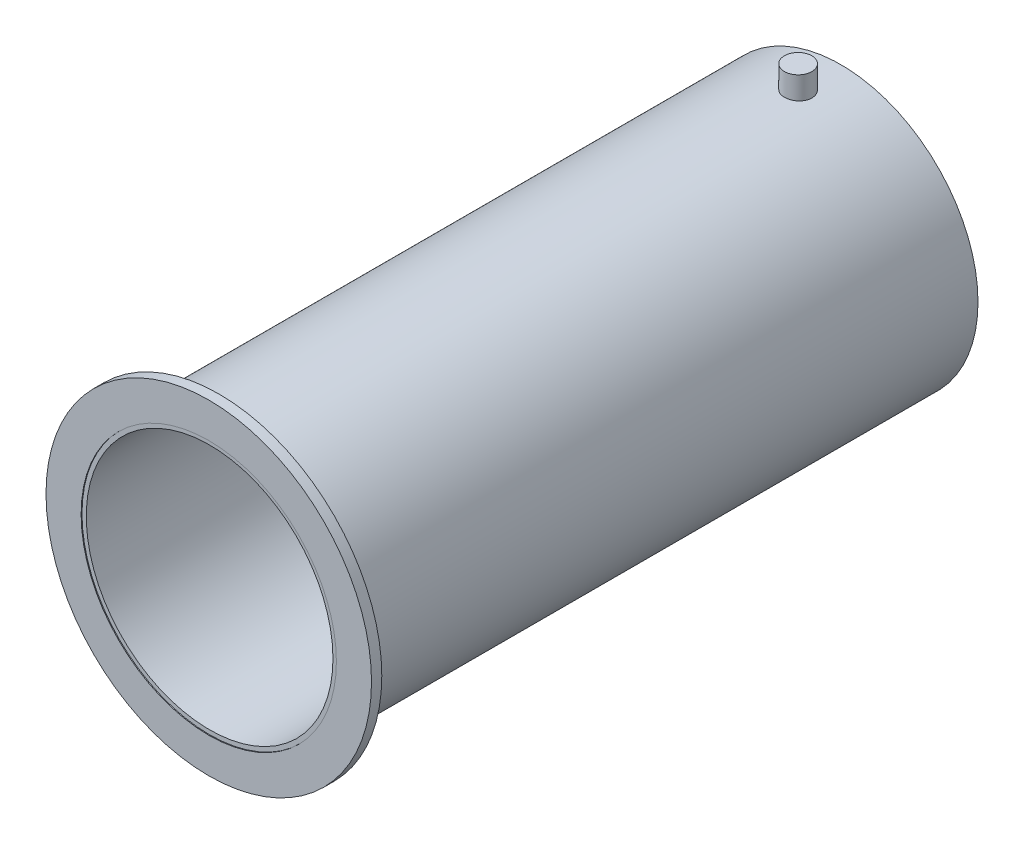
ISO-10303-21;
HEADER;
FILE_DESCRIPTION(('STEP AP214'),'2;1');
FILE_NAME('part.step','',(''),(''),'','','');
FILE_SCHEMA(('AUTOMOTIVE_DESIGN { 1 0 10303 214 1 1 1 1 }'));
ENDSEC;
DATA;
#1=APPLICATION_CONTEXT('core data for automotive mechanical design processes');
#2=APPLICATION_PROTOCOL_DEFINITION('international standard','automotive_design',2000,#1);
#3=PRODUCT_CONTEXT('',#1,'mechanical');
#4=PRODUCT('Part','Part','',(#3));
#5=PRODUCT_RELATED_PRODUCT_CATEGORY('part','',(#4));
#6=PRODUCT_DEFINITION_FORMATION('','',#4);
#7=PRODUCT_DEFINITION_CONTEXT('part definition',#1,'design');
#8=PRODUCT_DEFINITION('design','',#6,#7);
#9=PRODUCT_DEFINITION_SHAPE('','',#8);
#10=(LENGTH_UNIT() NAMED_UNIT(*) SI_UNIT(.MILLI.,.METRE.));
#11=(NAMED_UNIT(*) PLANE_ANGLE_UNIT() SI_UNIT($,.RADIAN.));
#12=(NAMED_UNIT(*) SI_UNIT($,.STERADIAN.) SOLID_ANGLE_UNIT());
#13=UNCERTAINTY_MEASURE_WITH_UNIT(LENGTH_MEASURE(1.E-05),#10,'distance_accuracy_value','');
#14=(GEOMETRIC_REPRESENTATION_CONTEXT(3) GLOBAL_UNCERTAINTY_ASSIGNED_CONTEXT((#13)) GLOBAL_UNIT_ASSIGNED_CONTEXT((#10,
#11,#12)) REPRESENTATION_CONTEXT('',''));
#15=CARTESIAN_POINT('',(0.,0.,0.));
#16=DIRECTION('',(0.,0.,1.));
#17=DIRECTION('',(1.,0.,0.));
#18=AXIS2_PLACEMENT_3D('',#15,#16,#17);
#19=CARTESIAN_POINT('',(48.,0.,-4.));
#20=DIRECTION('',(0.,0.,-1.));
#21=DIRECTION('',(-1.,0.,0.));
#22=AXIS2_PLACEMENT_3D('',#19,#20,#21);
#23=CYLINDRICAL_SURFACE('',#22,16.);
#24=CARTESIAN_POINT('',(48.,0.,-12.));
#25=DIRECTION('',(0.,0.,1.));
#26=DIRECTION('',(1.,0.,0.));
#27=AXIS2_PLACEMENT_3D('',#24,#25,#26);
#28=CIRCLE('',#27,16.);
#29=CARTESIAN_POINT('',(64.,0.,-12.));
#30=VERTEX_POINT('',#29);
#31=EDGE_CURVE('E118',#30,#30,#28,.T.);
#32=ORIENTED_EDGE('',*,*,#31,.T.);
#33=EDGE_LOOP('',(#32));
#34=FACE_BOUND('',#33,.T.);
#35=CARTESIAN_POINT('',(48.,0.,60.6));
#36=DIRECTION('',(0.,0.,1.));
#37=DIRECTION('',(1.,0.,0.));
#38=AXIS2_PLACEMENT_3D('',#35,#36,#37);
#39=CIRCLE('',#38,16.);
#40=CARTESIAN_POINT('',(64.,0.,60.6));
#41=VERTEX_POINT('',#40);
#42=EDGE_CURVE('E57',#41,#41,#39,.T.);
#43=ORIENTED_EDGE('',*,*,#42,.F.);
#44=EDGE_LOOP('',(#43));
#45=FACE_BOUND('',#44,.T.);
#46=CARTESIAN_POINT('',(48.,16.,-8.6));
#47=CARTESIAN_POINT('',(47.9103674339335,15.9999989683323,-8.59999611855939));
#48=CARTESIAN_POINT('',(47.8206756077316,15.9992388095393,-8.59244276976569));
#49=CARTESIAN_POINT('',(47.6437785624051,15.9962794815158,-8.56242500753531));
#50=CARTESIAN_POINT('',(47.5565761933299,15.9940787269444,-8.53994416636066));
#51=CARTESIAN_POINT('',(47.3872453192745,15.9884866330091,-8.48073241504346));
#52=CARTESIAN_POINT('',(47.3051137846162,15.9850960128113,-8.44401011117044));
#53=CARTESIAN_POINT('',(47.1481981424634,15.9775033183089,-8.35737454730937));
#54=CARTESIAN_POINT('',(47.0734125779535,15.9733014054101,-8.30746391039978));
#55=CARTESIAN_POINT('',(46.9330247189215,15.9645399094612,-8.19567568374036));
#56=CARTESIAN_POINT('',(46.8674525682642,15.9599792251818,-8.13376032095674));
#57=CARTESIAN_POINT('',(46.7476119657104,15.9510233105002,-7.99980074517915));
#58=CARTESIAN_POINT('',(46.6933440366678,15.9466280877587,-7.92775606393218));
#59=CARTESIAN_POINT('',(46.5975456472902,15.9384894648445,-7.7753943493062));
#60=CARTESIAN_POINT('',(46.5560424552722,15.9347474673745,-7.69506008944822));
#61=CARTESIAN_POINT('',(46.4871257844116,15.9283526007444,-7.52851906255203));
#62=CARTESIAN_POINT('',(46.4597119574539,15.9256997046756,-7.44231244066568));
#63=CARTESIAN_POINT('',(46.419841533437,15.9217933451676,-7.26678111861438));
#64=CARTESIAN_POINT('',(46.4073349551939,15.9205352063695,-7.17746787703647));
#65=CARTESIAN_POINT('',(46.3974795437834,15.9195462889684,-6.99800181856675));
#66=CARTESIAN_POINT('',(46.4001303122067,15.9198154702199,-6.9078490238047));
#67=CARTESIAN_POINT('',(46.4204731515957,15.921846510383,-6.72960750449069));
#68=CARTESIAN_POINT('',(46.4381106494007,15.9236029534504,-6.64151248107409));
#69=CARTESIAN_POINT('',(46.4878413693591,15.9284021485987,-6.46953925887825));
#70=CARTESIAN_POINT('',(46.5199347867908,15.9314449180559,-6.38566111707995));
#71=CARTESIAN_POINT('',(46.5977265697896,15.9384801512331,-6.22433026032178));
#72=CARTESIAN_POINT('',(46.643449147648,15.9424743025305,-6.14688929681709));
#73=CARTESIAN_POINT('',(46.7471839562348,15.9509608277261,-6.00075965614099));
#74=CARTESIAN_POINT('',(46.8051965466616,15.9554532162046,-5.93207123522918));
#75=CARTESIAN_POINT('',(46.9321694201407,15.9644541650078,-5.80507936961756));
#76=CARTESIAN_POINT('',(47.0011768338378,15.968962709328,-5.74682303699072));
#77=CARTESIAN_POINT('',(47.1480168292206,15.9774692652563,-5.64271418734338));
#78=CARTESIAN_POINT('',(47.2258494208006,15.9814672762921,-5.59686168422964));
#79=CARTESIAN_POINT('',(47.3881630308922,15.9885036106735,-5.5188639675036));
#80=CARTESIAN_POINT('',(47.4726452057762,15.9915417666363,-5.4867211442911));
#81=CARTESIAN_POINT('',(47.6458444522721,15.9963143590625,-5.4370897332612));
#82=CARTESIAN_POINT('',(47.7345613971574,15.998048834513,-5.41960070721501));
#83=CARTESIAN_POINT('',(47.913303841453,16.000013626693,-5.39983310762438));
#84=CARTESIAN_POINT('',(48.0033220833688,16.0002503722838,-5.397489522796));
#85=CARTESIAN_POINT('',(48.1824700693051,15.9992102681088,-5.40790858087802));
#86=CARTESIAN_POINT('',(48.2715998253127,15.9979334387915,-5.42067101970445));
#87=CARTESIAN_POINT('',(48.4462531309355,15.9940137846271,-5.46088591267452));
#88=CARTESIAN_POINT('',(48.5317837583552,15.9913737906886,-5.48830792716482));
#89=CARTESIAN_POINT('',(48.697030914214,15.9850239817697,-5.55703227845964));
#90=CARTESIAN_POINT('',(48.7767473122514,15.9813141428041,-5.59833492646304));
#91=CARTESIAN_POINT('',(48.9283970882754,15.9732236052868,-5.69380934186227));
#92=CARTESIAN_POINT('',(49.0003034555983,15.9688406976551,-5.74802382228131));
#93=CARTESIAN_POINT('',(49.134018597299,15.9599029259123,-5.86772170838548));
#94=CARTESIAN_POINT('',(49.1958271181587,15.9553480574875,-5.93320539691251));
#95=CARTESIAN_POINT('',(49.3078177758194,15.9465603862521,-6.0738665194544));
#96=CARTESIAN_POINT('',(49.3579572458873,15.9423288022236,-6.1490780104682));
#97=CARTESIAN_POINT('',(49.4448932139901,15.9346853193742,-6.3068917762347));
#98=CARTESIAN_POINT('',(49.4816898944862,15.9312734093446,-6.38949394990144));
#99=CARTESIAN_POINT('',(49.5408243338952,15.9256631621448,-6.55959798314528));
#100=CARTESIAN_POINT('',(49.563187479699,15.9234626951966,-6.6470909441458));
#101=CARTESIAN_POINT('',(49.5929024114071,15.920517844526,-6.82461311673724));
#102=CARTESIAN_POINT('',(49.6002546278392,15.919773419043,-6.91464225551308));
#103=CARTESIAN_POINT('',(49.599733021554,15.919825809721,-7.09425710137073));
#104=CARTESIAN_POINT('',(49.591926223349,15.9206158413921,-7.18384301261251));
#105=CARTESIAN_POINT('',(49.5614487247418,15.9236336622327,-7.36042386746926));
#106=CARTESIAN_POINT('',(49.5387780076194,15.9258614530195,-7.44741880816957));
#107=CARTESIAN_POINT('',(49.479234698076,15.931501892211,-7.61634775847657));
#108=CARTESIAN_POINT('',(49.4423640709455,15.9349143766458,-7.69828246660756));
#109=CARTESIAN_POINT('',(49.3554744878577,15.9425400294297,-7.85481102667366));
#110=CARTESIAN_POINT('',(49.3054556055287,15.9467531932952,-7.92940491971301));
#111=CARTESIAN_POINT('',(49.1934376900565,15.9555277953552,-8.0694778791551));
#112=CARTESIAN_POINT('',(49.1313887182244,15.960090635628,-8.13491692218734));
#113=CARTESIAN_POINT('',(48.9971707187602,15.9690376756605,-8.25448357231946));
#114=CARTESIAN_POINT('',(48.9249992705732,15.9734218323676,-8.30860846617147));
#115=CARTESIAN_POINT('',(48.7723862946581,15.9815289931066,-8.40411752616739));
#116=CARTESIAN_POINT('',(48.6919243989548,15.985250304429,-8.44546926551229));
#117=CARTESIAN_POINT('',(48.5252132465609,15.9915940679983,-8.51401987651819));
#118=CARTESIAN_POINT('',(48.438970639721,15.9942177585545,-8.54123470552567));
#119=CARTESIAN_POINT('',(48.2935332182491,15.9974114203797,-8.57395298733568));
#120=CARTESIAN_POINT('',(48.2352680845512,15.9983776110693,-8.58370727087897));
#121=CARTESIAN_POINT('',(48.1180105293077,15.9996722392126,-8.59673204169882));
#122=CARTESIAN_POINT('',(48.0590181107625,16.0000006792964,-8.60000255571498));
#123=CARTESIAN_POINT('',(48.,16.,-8.6));
#124=B_SPLINE_CURVE_WITH_KNOTS('',3,(#46,#47,#48,#49,#50,#51,#52,#53,#54,#55,#56,#57,#58,#59,
#60,#61,#62,#63,#64,#65,#66,#67,#68,#69,#70,#71,#72,#73,#74,#75,#76,#77,#78,#79,#80,#81,#82,#83,
#84,#85,#86,#87,#88,#89,#90,#91,#92,#93,#94,#95,#96,#97,#98,#99,#100,#101,#102,#103,#104,#105,
#106,#107,#108,#109,#110,#111,#112,#113,#114,#115,#116,#117,#118,#119,#120,#121,#122,#123),
.UNSPECIFIED.,.T.,.F.,(4,2,2,2,2,2,2,2,2,2,2,2,2,2,2,2,2,2,2,2,2,2,2,2,2,2,2,2,2,2,2,2,2,2,2,2,
2,2,4),(0.,0.268682186029559,0.537660548536776,0.80647661717152,1.07523926013245,
1.34486170979671,1.61449662753129,1.88470360755555,2.15490391108006,2.42419571272314,
2.69348043609242,2.96178875905777,3.23010070658613,3.49889218196631,3.767691525298,
4.0376757471393,4.30766027167634,4.5776918510973,4.84771535480702,5.11657901772411,
5.38543904830628,5.65374296470886,5.92205289679146,6.19126305197916,6.46047996496366,
6.73066629773757,7.00084893560598,7.27055504948804,7.54025342783335,7.80876206870329,
8.07727101161662,8.34574280580479,8.61421309662335,8.88382267884245,9.15349684219131,
9.42385009641986,9.6938975167247,9.87081067571756,10.0477231051044),.UNSPECIFIED.);
#125=CARTESIAN_POINT('',(48.,16.,-8.6));
#126=VERTEX_POINT('',#125);
#127=EDGE_CURVE('E55',#126,#126,#124,.T.);
#128=ORIENTED_EDGE('',*,*,#127,.F.);
#129=EDGE_LOOP('',(#128));
#130=FACE_BOUND('',#129,.T.);
#131=CARTESIAN_POINT('',(48.,-16.,-8.6));
#132=CARTESIAN_POINT('',(48.0896325660665,-15.9999989683323,-8.59999611855939));
#133=CARTESIAN_POINT('',(48.1793243922684,-15.9992388095393,-8.59244276976569));
#134=CARTESIAN_POINT('',(48.3562214375949,-15.9962794815158,-8.56242500753531));
#135=CARTESIAN_POINT('',(48.4434238066701,-15.9940787269444,-8.53994416636066));
#136=CARTESIAN_POINT('',(48.6127546807255,-15.9884866330091,-8.48073241504346));
#137=CARTESIAN_POINT('',(48.6948862153838,-15.9850960128113,-8.44401011117044));
#138=CARTESIAN_POINT('',(48.8518018575366,-15.9775033183089,-8.35737454730937));
#139=CARTESIAN_POINT('',(48.9265874220465,-15.9733014054101,-8.30746391039978));
#140=CARTESIAN_POINT('',(49.0669752810785,-15.9645399094612,-8.19567568374036));
#141=CARTESIAN_POINT('',(49.1325474317358,-15.9599792251818,-8.13376032095674));
#142=CARTESIAN_POINT('',(49.2523880342896,-15.9510233105002,-7.99980074517915));
#143=CARTESIAN_POINT('',(49.3066559633322,-15.9466280877587,-7.92775606393218));
#144=CARTESIAN_POINT('',(49.4024543527098,-15.9384894648445,-7.77539434930621));
#145=CARTESIAN_POINT('',(49.4439575447278,-15.9347474673745,-7.69506008944822));
#146=CARTESIAN_POINT('',(49.5128742155884,-15.9283526007444,-7.52851906255203));
#147=CARTESIAN_POINT('',(49.5402880425461,-15.9256997046756,-7.44231244066568));
#148=CARTESIAN_POINT('',(49.580158466563,-15.9217933451676,-7.26678111861438));
#149=CARTESIAN_POINT('',(49.5926650448061,-15.9205352063695,-7.17746787703647));
#150=CARTESIAN_POINT('',(49.6025204562166,-15.9195462889684,-6.99800181856675));
#151=CARTESIAN_POINT('',(49.5998696877933,-15.9198154702199,-6.9078490238047));
#152=CARTESIAN_POINT('',(49.5795268484043,-15.921846510383,-6.72960750449069));
#153=CARTESIAN_POINT('',(49.5618893505993,-15.9236029534504,-6.64151248107409));
#154=CARTESIAN_POINT('',(49.5121586306409,-15.9284021485987,-6.46953925887825));
#155=CARTESIAN_POINT('',(49.4800652132092,-15.9314449180559,-6.38566111707995));
#156=CARTESIAN_POINT('',(49.4022734302104,-15.9384801512331,-6.22433026032178));
#157=CARTESIAN_POINT('',(49.356550852352,-15.9424743025305,-6.1468892968171));
#158=CARTESIAN_POINT('',(49.2528160437652,-15.9509608277261,-6.00075965614099));
#159=CARTESIAN_POINT('',(49.1948034533384,-15.9554532162046,-5.93207123522918));
#160=CARTESIAN_POINT('',(49.0678305798593,-15.9644541650078,-5.80507936961756));
#161=CARTESIAN_POINT('',(48.9988231661622,-15.968962709328,-5.74682303699072));
#162=CARTESIAN_POINT('',(48.8519831707794,-15.9774692652563,-5.64271418734338));
#163=CARTESIAN_POINT('',(48.7741505791994,-15.9814672762921,-5.59686168422964));
#164=CARTESIAN_POINT('',(48.6118369691078,-15.9885036106735,-5.5188639675036));
#165=CARTESIAN_POINT('',(48.5273547942238,-15.9915417666363,-5.4867211442911));
#166=CARTESIAN_POINT('',(48.3541555477279,-15.9963143590625,-5.4370897332612));
#167=CARTESIAN_POINT('',(48.2654386028426,-15.998048834513,-5.41960070721501));
#168=CARTESIAN_POINT('',(48.086696158547,-16.000013626693,-5.39983310762438));
#169=CARTESIAN_POINT('',(47.9966779166312,-16.0002503722838,-5.397489522796));
#170=CARTESIAN_POINT('',(47.8175299306949,-15.9992102681088,-5.40790858087802));
#171=CARTESIAN_POINT('',(47.7284001746873,-15.9979334387915,-5.42067101970445));
#172=CARTESIAN_POINT('',(47.5537468690645,-15.9940137846271,-5.46088591267452));
#173=CARTESIAN_POINT('',(47.4682162416448,-15.9913737906886,-5.48830792716482));
#174=CARTESIAN_POINT('',(47.302969085786,-15.9850239817697,-5.55703227845964));
#175=CARTESIAN_POINT('',(47.2232526877486,-15.9813141428041,-5.59833492646304));
#176=CARTESIAN_POINT('',(47.0716029117246,-15.9732236052868,-5.69380934186227));
#177=CARTESIAN_POINT('',(46.9996965444017,-15.9688406976551,-5.74802382228131));
#178=CARTESIAN_POINT('',(46.865981402701,-15.9599029259123,-5.86772170838549));
#179=CARTESIAN_POINT('',(46.8041728818413,-15.9553480574875,-5.93320539691251));
#180=CARTESIAN_POINT('',(46.6921822241806,-15.9465603862521,-6.0738665194544));
#181=CARTESIAN_POINT('',(46.6420427541127,-15.9423288022236,-6.1490780104682));
#182=CARTESIAN_POINT('',(46.5551067860099,-15.9346853193742,-6.3068917762347));
#183=CARTESIAN_POINT('',(46.5183101055138,-15.9312734093446,-6.38949394990144));
#184=CARTESIAN_POINT('',(46.4591756661048,-15.9256631621448,-6.55959798314528));
#185=CARTESIAN_POINT('',(46.436812520301,-15.9234626951966,-6.6470909441458));
#186=CARTESIAN_POINT('',(46.4070975885929,-15.920517844526,-6.82461311673724));
#187=CARTESIAN_POINT('',(46.3997453721608,-15.919773419043,-6.91464225551308));
#188=CARTESIAN_POINT('',(46.400266978446,-15.919825809721,-7.09425710137073));
#189=CARTESIAN_POINT('',(46.408073776651,-15.9206158413921,-7.18384301261251));
#190=CARTESIAN_POINT('',(46.4385512752582,-15.9236336622327,-7.36042386746926));
#191=CARTESIAN_POINT('',(46.4612219923806,-15.9258614530195,-7.44741880816957));
#192=CARTESIAN_POINT('',(46.520765301924,-15.931501892211,-7.61634775847657));
#193=CARTESIAN_POINT('',(46.5576359290545,-15.9349143766458,-7.69828246660756));
#194=CARTESIAN_POINT('',(46.6445255121423,-15.9425400294297,-7.85481102667366));
#195=CARTESIAN_POINT('',(46.6945443944713,-15.9467531932952,-7.92940491971301));
#196=CARTESIAN_POINT('',(46.8065623099435,-15.9555277953552,-8.06947787915509));
#197=CARTESIAN_POINT('',(46.8686112817756,-15.960090635628,-8.13491692218733));
#198=CARTESIAN_POINT('',(47.0028292812398,-15.9690376756605,-8.25448357231945));
#199=CARTESIAN_POINT('',(47.0750007294268,-15.9734218323676,-8.30860846617147));
#200=CARTESIAN_POINT('',(47.2276137053419,-15.9815289931066,-8.40411752616739));
#201=CARTESIAN_POINT('',(47.3080756010452,-15.985250304429,-8.44546926551229));
#202=CARTESIAN_POINT('',(47.4747867534391,-15.9915940679983,-8.51401987651819));
#203=CARTESIAN_POINT('',(47.561029360279,-15.9942177585545,-8.54123470552567));
#204=CARTESIAN_POINT('',(47.7064667817509,-15.9974114203797,-8.57395298733568));
#205=CARTESIAN_POINT('',(47.7647319154488,-15.9983776110693,-8.58370727087897));
#206=CARTESIAN_POINT('',(47.8819894706923,-15.9996722392126,-8.59673204169882));
#207=CARTESIAN_POINT('',(47.9409818892375,-16.0000006792964,-8.60000255571498));
#208=CARTESIAN_POINT('',(48.,-16.,-8.6));
#209=B_SPLINE_CURVE_WITH_KNOTS('',3,(#131,#132,#133,#134,#135,#136,#137,#138,#139,#140,#141,
#142,#143,#144,#145,#146,#147,#148,#149,#150,#151,#152,#153,#154,#155,#156,#157,#158,#159,#160,
#161,#162,#163,#164,#165,#166,#167,#168,#169,#170,#171,#172,#173,#174,#175,#176,#177,#178,#179,
#180,#181,#182,#183,#184,#185,#186,#187,#188,#189,#190,#191,#192,#193,#194,#195,#196,#197,#198,
#199,#200,#201,#202,#203,#204,#205,#206,#207,#208),.UNSPECIFIED.,.T.,.F.,(4,2,2,2,2,2,2,2,2,2,2,
2,2,2,2,2,2,2,2,2,2,2,2,2,2,2,2,2,2,2,2,2,2,2,2,2,2,2,4),(0.,0.268682186029559,
0.537660548536776,0.80647661717152,1.07523926013245,1.34486170979671,1.61449662753129,
1.88470360755555,2.15490391108006,2.42419571272314,2.69348043609242,2.96178875905777,
3.23010070658613,3.49889218196631,3.767691525298,4.0376757471393,4.30766027167634,
4.57769185109729,4.84771535480702,5.11657901772411,5.38543904830628,5.65374296470886,
5.92205289679146,6.19126305197916,6.46047996496366,6.73066629773757,7.00084893560598,
7.27055504948804,7.54025342783335,7.80876206870329,8.07727101161662,8.34574280580479,
8.61421309662335,8.88382267884243,9.15349684219131,9.42385009641986,9.6938975167247,
9.87081067571756,10.0477231051044),.UNSPECIFIED.);
#210=CARTESIAN_POINT('',(48.,-16.,-8.6));
#211=VERTEX_POINT('',#210);
#212=EDGE_CURVE('E10',#211,#211,#209,.T.);
#213=ORIENTED_EDGE('',*,*,#212,.F.);
#214=EDGE_LOOP('',(#213));
#215=FACE_BOUND('',#214,.T.);
#216=ADVANCED_FACE('F41',(#34,#45,#130,#215),#23,.T.);
#217=CARTESIAN_POINT('',(48.,0.,61.7));
#218=DIRECTION('',(0.,0.,1.));
#219=DIRECTION('',(1.,0.,0.));
#220=AXIS2_PLACEMENT_3D('',#217,#218,#219);
#221=PLANE('',#220);
#222=CARTESIAN_POINT('',(48.,0.,61.7));
#223=DIRECTION('',(0.,0.,1.));
#224=DIRECTION('',(1.,0.,0.));
#225=AXIS2_PLACEMENT_3D('',#222,#223,#224);
#226=CIRCLE('',#225,14.4);
#227=CARTESIAN_POINT('',(62.4,0.,61.7));
#228=VERTEX_POINT('',#227);
#229=EDGE_CURVE('E136',#228,#228,#226,.T.);
#230=ORIENTED_EDGE('',*,*,#229,.F.);
#231=EDGE_LOOP('',(#230));
#232=FACE_BOUND('',#231,.T.);
#233=CARTESIAN_POINT('',(48.,0.,61.7));
#234=DIRECTION('',(0.,0.,1.));
#235=DIRECTION('',(1.,0.,0.));
#236=AXIS2_PLACEMENT_3D('',#233,#234,#235);
#237=CIRCLE('',#236,14.9);
#238=CARTESIAN_POINT('',(62.9,0.,61.7));
#239=VERTEX_POINT('',#238);
#240=EDGE_CURVE('E58',#239,#239,#237,.F.);
#241=ORIENTED_EDGE('',*,*,#240,.F.);
#242=EDGE_LOOP('',(#241));
#243=FACE_BOUND('',#242,.T.);
#244=ADVANCED_FACE('F92',(#232,#243),#221,.T.);
#245=CARTESIAN_POINT('',(48.,0.,-4.));
#246=DIRECTION('',(0.,0.,1.));
#247=DIRECTION('',(1.,0.,0.));
#248=AXIS2_PLACEMENT_3D('',#245,#246,#247);
#249=PLANE('',#248);
#250=CARTESIAN_POINT('',(48.,0.,-4.));
#251=DIRECTION('',(0.,0.,1.));
#252=DIRECTION('',(1.,0.,0.));
#253=AXIS2_PLACEMENT_3D('',#250,#251,#252);
#254=CIRCLE('',#253,13.);
#255=CARTESIAN_POINT('',(61.,0.,-4.));
#256=VERTEX_POINT('',#255);
#257=EDGE_CURVE('E144',#256,#256,#254,.T.);
#258=ORIENTED_EDGE('',*,*,#257,.F.);
#259=EDGE_LOOP('',(#258));
#260=FACE_BOUND('',#259,.T.);
#261=CARTESIAN_POINT('',(48.,0.,-4.));
#262=DIRECTION('',(0.,0.,1.));
#263=DIRECTION('',(1.,0.,0.));
#264=AXIS2_PLACEMENT_3D('',#261,#262,#263);
#265=CIRCLE('',#264,14.4);
#266=CARTESIAN_POINT('',(62.4,0.,-4.));
#267=VERTEX_POINT('',#266);
#268=EDGE_CURVE('E134',#267,#267,#265,.T.);
#269=ORIENTED_EDGE('',*,*,#268,.T.);
#270=EDGE_LOOP('',(#269));
#271=FACE_BOUND('',#270,.T.);
#272=ADVANCED_FACE('F98',(#260,#271),#249,.T.);
#273=CARTESIAN_POINT('',(48.,0.,-12.));
#274=DIRECTION('',(0.,0.,1.));
#275=DIRECTION('',(1.,0.,0.));
#276=AXIS2_PLACEMENT_3D('',#273,#274,#275);
#277=PLANE('',#276);
#278=ORIENTED_EDGE('',*,*,#31,.F.);
#279=EDGE_LOOP('',(#278));
#280=FACE_BOUND('',#279,.T.);
#281=CARTESIAN_POINT('',(48.,0.,-12.));
#282=DIRECTION('',(0.,0.,1.));
#283=DIRECTION('',(1.,0.,0.));
#284=AXIS2_PLACEMENT_3D('',#281,#282,#283);
#285=CIRCLE('',#284,13.);
#286=CARTESIAN_POINT('',(61.,0.,-12.));
#287=VERTEX_POINT('',#286);
#288=EDGE_CURVE('E142',#287,#287,#285,.T.);
#289=ORIENTED_EDGE('',*,*,#288,.T.);
#290=EDGE_LOOP('',(#289));
#291=FACE_BOUND('',#290,.T.);
#292=ADVANCED_FACE('F105',(#280,#291),#277,.F.);
#293=CARTESIAN_POINT('',(48.,0.,-4.));
#294=DIRECTION('',(0.,0.,-1.));
#295=DIRECTION('',(-1.,0.,0.));
#296=AXIS2_PLACEMENT_3D('',#293,#294,#295);
#297=CYLINDRICAL_SURFACE('',#296,13.);
#298=ORIENTED_EDGE('',*,*,#257,.T.);
#299=EDGE_LOOP('',(#298));
#300=FACE_BOUND('',#299,.T.);
#301=ORIENTED_EDGE('',*,*,#288,.F.);
#302=EDGE_LOOP('',(#301));
#303=FACE_BOUND('',#302,.T.);
#304=ADVANCED_FACE('F91',(#300,#303),#297,.F.);
#305=CARTESIAN_POINT('',(48.,0.,61.7));
#306=DIRECTION('',(0.,0.,-1.));
#307=DIRECTION('',(-1.,0.,0.));
#308=AXIS2_PLACEMENT_3D('',#305,#306,#307);
#309=CYLINDRICAL_SURFACE('',#308,14.4);
#310=ORIENTED_EDGE('',*,*,#229,.T.);
#311=EDGE_LOOP('',(#310));
#312=FACE_BOUND('',#311,.T.);
#313=ORIENTED_EDGE('',*,*,#268,.F.);
#314=EDGE_LOOP('',(#313));
#315=FACE_BOUND('',#314,.T.);
#316=ADVANCED_FACE('F85',(#312,#315),#309,.F.);
#317=CARTESIAN_POINT('',(48.,0.,61.8));
#318=DIRECTION('',(0.,0.,1.));
#319=DIRECTION('',(1.,0.,0.));
#320=AXIS2_PLACEMENT_3D('',#317,#318,#319);
#321=PLANE('',#320);
#322=CARTESIAN_POINT('',(48.,0.,61.8));
#323=DIRECTION('',(0.,0.,1.));
#324=DIRECTION('',(1.,0.,0.));
#325=AXIS2_PLACEMENT_3D('',#322,#323,#324);
#326=CIRCLE('',#325,19.);
#327=CARTESIAN_POINT('',(67.,0.,61.8));
#328=VERTEX_POINT('',#327);
#329=EDGE_CURVE('E129',#328,#328,#326,.T.);
#330=ORIENTED_EDGE('',*,*,#329,.T.);
#331=EDGE_LOOP('',(#330));
#332=FACE_BOUND('',#331,.T.);
#333=CARTESIAN_POINT('',(48.,0.,61.8));
#334=DIRECTION('',(0.,0.,1.));
#335=DIRECTION('',(1.,0.,0.));
#336=AXIS2_PLACEMENT_3D('',#333,#334,#335);
#337=CIRCLE('',#336,14.9);
#338=CARTESIAN_POINT('',(62.9,0.,61.8));
#339=VERTEX_POINT('',#338);
#340=EDGE_CURVE('E128',#339,#339,#337,.T.);
#341=ORIENTED_EDGE('',*,*,#340,.F.);
#342=EDGE_LOOP('',(#341));
#343=FACE_BOUND('',#342,.T.);
#344=ADVANCED_FACE('F76',(#332,#343),#321,.T.);
#345=CARTESIAN_POINT('',(48.,0.,60.6));
#346=DIRECTION('',(0.,0.,1.));
#347=DIRECTION('',(1.,0.,0.));
#348=AXIS2_PLACEMENT_3D('',#345,#346,#347);
#349=PLANE('',#348);
#350=ORIENTED_EDGE('',*,*,#42,.T.);
#351=EDGE_LOOP('',(#350));
#352=FACE_BOUND('',#351,.T.);
#353=CARTESIAN_POINT('',(48.,0.,60.6));
#354=DIRECTION('',(0.,0.,1.));
#355=DIRECTION('',(1.,0.,0.));
#356=AXIS2_PLACEMENT_3D('',#353,#354,#355);
#357=CIRCLE('',#356,19.);
#358=CARTESIAN_POINT('',(67.,0.,60.6));
#359=VERTEX_POINT('',#358);
#360=EDGE_CURVE('E130',#359,#359,#357,.T.);
#361=ORIENTED_EDGE('',*,*,#360,.F.);
#362=EDGE_LOOP('',(#361));
#363=FACE_BOUND('',#362,.T.);
#364=ADVANCED_FACE('F84',(#352,#363),#349,.F.);
#365=CARTESIAN_POINT('',(48.,0.,61.8));
#366=DIRECTION('',(0.,0.,-1.));
#367=DIRECTION('',(-1.,0.,0.));
#368=AXIS2_PLACEMENT_3D('',#365,#366,#367);
#369=CYLINDRICAL_SURFACE('',#368,19.);
#370=ORIENTED_EDGE('',*,*,#329,.F.);
#371=EDGE_LOOP('',(#370));
#372=FACE_BOUND('',#371,.T.);
#373=ORIENTED_EDGE('',*,*,#360,.T.);
#374=EDGE_LOOP('',(#373));
#375=FACE_BOUND('',#374,.T.);
#376=ADVANCED_FACE('F80',(#372,#375),#369,.T.);
#377=CARTESIAN_POINT('',(48.,0.,61.8));
#378=DIRECTION('',(0.,0.,-1.));
#379=DIRECTION('',(-1.,0.,0.));
#380=AXIS2_PLACEMENT_3D('',#377,#378,#379);
#381=CYLINDRICAL_SURFACE('',#380,14.9);
#382=ORIENTED_EDGE('',*,*,#240,.T.);
#383=EDGE_LOOP('',(#382));
#384=FACE_BOUND('',#383,.T.);
#385=ORIENTED_EDGE('',*,*,#340,.T.);
#386=EDGE_LOOP('',(#385));
#387=FACE_BOUND('',#386,.T.);
#388=ADVANCED_FACE('F71',(#384,#387),#381,.F.);
#389=CARTESIAN_POINT('',(48.,18.6,-7.));
#390=DIRECTION('',(0.,-1.,0.));
#391=DIRECTION('',(0.,0.,-1.));
#392=AXIS2_PLACEMENT_3D('',#389,#390,#391);
#393=CYLINDRICAL_SURFACE('',#392,1.6);
#394=CARTESIAN_POINT('',(48.,18.6,-7.));
#395=DIRECTION('',(0.,1.,0.));
#396=DIRECTION('',(0.,0.,1.));
#397=AXIS2_PLACEMENT_3D('',#394,#395,#396);
#398=CIRCLE('',#397,1.6);
#399=CARTESIAN_POINT('',(48.,18.6,-5.4));
#400=VERTEX_POINT('',#399);
#401=EDGE_CURVE('E137',#400,#400,#398,.T.);
#402=ORIENTED_EDGE('',*,*,#401,.F.);
#403=EDGE_LOOP('',(#402));
#404=FACE_BOUND('',#403,.T.);
#405=ORIENTED_EDGE('',*,*,#127,.T.);
#406=EDGE_LOOP('',(#405));
#407=FACE_BOUND('',#406,.T.);
#408=ADVANCED_FACE('F69',(#404,#407),#393,.T.);
#409=CARTESIAN_POINT('',(48.,18.6,-7.));
#410=DIRECTION('',(0.,1.,0.));
#411=DIRECTION('',(0.,0.,1.));
#412=AXIS2_PLACEMENT_3D('',#409,#410,#411);
#413=PLANE('',#412);
#414=ORIENTED_EDGE('',*,*,#401,.T.);
#415=EDGE_LOOP('',(#414));
#416=FACE_BOUND('',#415,.T.);
#417=ADVANCED_FACE('F75',(#416),#413,.T.);
#418=CARTESIAN_POINT('',(48.,-15.,-7.));
#419=DIRECTION('',(0.,-1.,0.));
#420=DIRECTION('',(0.,0.,-1.));
#421=AXIS2_PLACEMENT_3D('',#418,#419,#420);
#422=CYLINDRICAL_SURFACE('',#421,1.6);
#423=CARTESIAN_POINT('',(48.,-18.6,-7.));
#424=DIRECTION('',(0.,1.,0.));
#425=DIRECTION('',(0.,0.,1.));
#426=AXIS2_PLACEMENT_3D('',#423,#424,#425);
#427=CIRCLE('',#426,1.6);
#428=CARTESIAN_POINT('',(48.,-18.6,-5.4));
#429=VERTEX_POINT('',#428);
#430=EDGE_CURVE('E167',#429,#429,#427,.T.);
#431=ORIENTED_EDGE('',*,*,#430,.T.);
#432=EDGE_LOOP('',(#431));
#433=FACE_BOUND('',#432,.T.);
#434=ORIENTED_EDGE('',*,*,#212,.T.);
#435=EDGE_LOOP('',(#434));
#436=FACE_BOUND('',#435,.T.);
#437=ADVANCED_FACE('F168',(#433,#436),#422,.T.);
#438=CARTESIAN_POINT('',(48.,-18.6,-7.));
#439=DIRECTION('',(0.,1.,0.));
#440=DIRECTION('',(0.,0.,1.));
#441=AXIS2_PLACEMENT_3D('',#438,#439,#440);
#442=PLANE('',#441);
#443=ORIENTED_EDGE('',*,*,#430,.F.);
#444=EDGE_LOOP('',(#443));
#445=FACE_BOUND('',#444,.T.);
#446=ADVANCED_FACE('F175',(#445),#442,.F.);
#447=CLOSED_SHELL('',(#216,#244,#272,#292,#304,#316,#344,#364,#376,#388,#408,#417,#437,#446));
#448=MANIFOLD_SOLID_BREP('B2',#447);
#449=ADVANCED_BREP_SHAPE_REPRESENTATION('',(#18,#448),#14);
#450=SHAPE_DEFINITION_REPRESENTATION(#9,#449);
ENDSEC;
END-ISO-10303-21;
